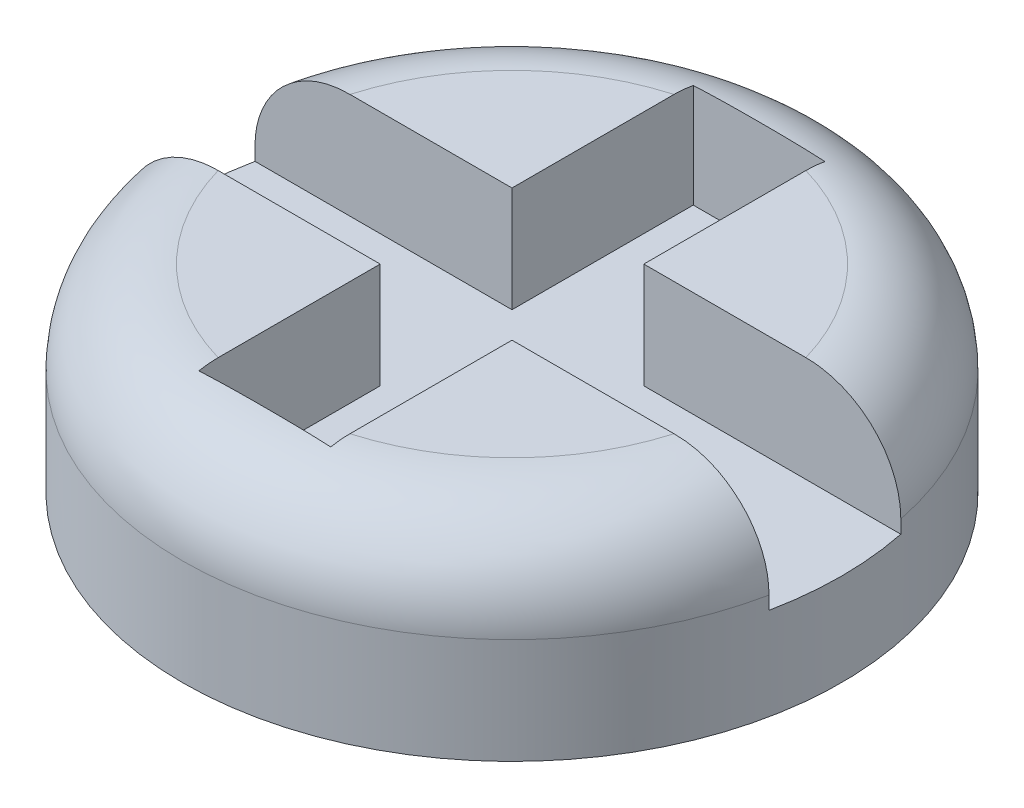
ISO-10303-21;
HEADER;
FILE_DESCRIPTION(('STEP AP214'),'2;1');
FILE_NAME('part.step','',(''),(''),'','','');
FILE_SCHEMA(('AUTOMOTIVE_DESIGN { 1 0 10303 214 1 1 1 1 }'));
ENDSEC;
DATA;
#1=APPLICATION_CONTEXT('core data for automotive mechanical design processes');
#2=APPLICATION_PROTOCOL_DEFINITION('international standard','automotive_design',2000,#1);
#3=PRODUCT_CONTEXT('',#1,'mechanical');
#4=PRODUCT('Part','Part','',(#3));
#5=PRODUCT_RELATED_PRODUCT_CATEGORY('part','',(#4));
#6=PRODUCT_DEFINITION_FORMATION('','',#4);
#7=PRODUCT_DEFINITION_CONTEXT('part definition',#1,'design');
#8=PRODUCT_DEFINITION('design','',#6,#7);
#9=PRODUCT_DEFINITION_SHAPE('','',#8);
#10=(LENGTH_UNIT() NAMED_UNIT(*) SI_UNIT(.MILLI.,.METRE.));
#11=(NAMED_UNIT(*) PLANE_ANGLE_UNIT() SI_UNIT($,.RADIAN.));
#12=(NAMED_UNIT(*) SI_UNIT($,.STERADIAN.) SOLID_ANGLE_UNIT());
#13=UNCERTAINTY_MEASURE_WITH_UNIT(LENGTH_MEASURE(1.E-05),#10,'distance_accuracy_value','');
#14=(GEOMETRIC_REPRESENTATION_CONTEXT(3) GLOBAL_UNCERTAINTY_ASSIGNED_CONTEXT((#13)) GLOBAL_UNIT_ASSIGNED_CONTEXT((#10,
#11,#12)) REPRESENTATION_CONTEXT('',''));
#15=CARTESIAN_POINT('',(0.,0.,0.));
#16=DIRECTION('',(0.,0.,1.));
#17=DIRECTION('',(1.,0.,0.));
#18=AXIS2_PLACEMENT_3D('',#15,#16,#17);
#19=CARTESIAN_POINT('',(-0.5,0.7,1.875));
#20=DIRECTION('',(-1.,0.,0.));
#21=DIRECTION('',(0.,0.,1.));
#22=AXIS2_PLACEMENT_3D('',#19,#20,#21);
#23=PLANE('',#22);
#24=CARTESIAN_POINT('',(-0.5,1.5,1.72916164657906));
#25=CARTESIAN_POINT('',(-0.5,1.5,1.80303155180772));
#26=CARTESIAN_POINT('',(-0.5,1.48575040161637,1.875));
#27=B_SPLINE_CURVE_WITH_KNOTS('',2,(#24,#25,#26),.UNSPECIFIED.,.F.,.F.,(3,3),(0.,1.),.UNSPECIFIED.);
#28=CARTESIAN_POINT('',(-0.5,1.5,1.72916164657906));
#29=VERTEX_POINT('',#28);
#30=CARTESIAN_POINT('',(-0.5,1.48575040161637,1.875));
#31=VERTEX_POINT('',#30);
#32=EDGE_CURVE('E531',#29,#31,#27,.T.);
#33=ORIENTED_EDGE('',*,*,#32,.T.);
#34=DIRECTION('',(0.,1.,0.));
#35=VECTOR('',#34,1.);
#36=CARTESIAN_POINT('',(-0.5,0.7,1.875));
#37=LINE('',#36,#35);
#38=CARTESIAN_POINT('',(-0.5,0.7,1.875));
#39=VERTEX_POINT('',#38);
#40=EDGE_CURVE('E11',#39,#31,#37,.T.);
#41=ORIENTED_EDGE('',*,*,#40,.F.);
#42=DIRECTION('',(0.,0.,1.));
#43=VECTOR('',#42,1.);
#44=CARTESIAN_POINT('',(-0.5,0.7,1.875));
#45=LINE('',#44,#43);
#46=CARTESIAN_POINT('',(-0.5,0.7,0.5));
#47=VERTEX_POINT('',#46);
#48=EDGE_CURVE('E223',#47,#39,#45,.T.);
#49=ORIENTED_EDGE('',*,*,#48,.F.);
#50=DIRECTION('',(0.,1.,0.));
#51=VECTOR('',#50,1.);
#52=CARTESIAN_POINT('',(-0.5,0.7,0.5));
#53=LINE('',#52,#51);
#54=CARTESIAN_POINT('',(-0.5,1.5,0.5));
#55=VERTEX_POINT('',#54);
#56=EDGE_CURVE('E178',#47,#55,#53,.T.);
#57=ORIENTED_EDGE('',*,*,#56,.T.);
#58=DIRECTION('',(0.,0.,1.));
#59=VECTOR('',#58,1.);
#60=CARTESIAN_POINT('',(-0.5,1.5,1.875));
#61=LINE('',#60,#59);
#62=EDGE_CURVE('E208',#55,#29,#61,.T.);
#63=ORIENTED_EDGE('',*,*,#62,.T.);
#64=EDGE_LOOP('',(#33,#41,#49,#57,#63));
#65=FACE_BOUND('',#64,.T.);
#66=ADVANCED_FACE('F16',(#65),#23,.F.);
#67=CARTESIAN_POINT('',(0.5,0.7,1.875));
#68=DIRECTION('',(0.,0.,1.));
#69=DIRECTION('',(1.,0.,0.));
#70=AXIS2_PLACEMENT_3D('',#67,#68,#69);
#71=PLANE('',#70);
#72=CARTESIAN_POINT('',(-0.50000000000035,1.48575040161635,1.875));
#73=CARTESIAN_POINT('',(-0.306527593114732,1.49596563404367,1.875));
#74=CARTESIAN_POINT('',(0.,1.49597054535375,1.875));
#75=CARTESIAN_POINT('',(0.306341613063809,1.49597545368399,1.875));
#76=CARTESIAN_POINT('',(0.500000000000349,1.48575040161635,1.875));
#77=B_SPLINE_CURVE_WITH_KNOTS('',2,(#72,#73,#74,#75,#76),.UNSPECIFIED.,.F.,.F.,(3,2,3),(0.,0.5,
1.),.UNSPECIFIED.);
#78=CARTESIAN_POINT('',(0.5,1.48575040161637,1.875));
#79=VERTEX_POINT('',#78);
#80=EDGE_CURVE('E529',#31,#79,#77,.T.);
#81=ORIENTED_EDGE('',*,*,#80,.T.);
#82=DIRECTION('',(0.,1.,0.));
#83=VECTOR('',#82,1.);
#84=CARTESIAN_POINT('',(0.5,0.7,1.875));
#85=LINE('',#84,#83);
#86=CARTESIAN_POINT('',(0.5,0.7,1.875));
#87=VERTEX_POINT('',#86);
#88=EDGE_CURVE('E28',#87,#79,#85,.T.);
#89=ORIENTED_EDGE('',*,*,#88,.F.);
#90=DIRECTION('',(1.,0.,0.));
#91=VECTOR('',#90,1.);
#92=CARTESIAN_POINT('',(0.5,0.7,1.875));
#93=LINE('',#92,#91);
#94=EDGE_CURVE('E187',#39,#87,#93,.T.);
#95=ORIENTED_EDGE('',*,*,#94,.F.);
#96=ORIENTED_EDGE('',*,*,#40,.T.);
#97=EDGE_LOOP('',(#81,#89,#95,#96));
#98=FACE_BOUND('',#97,.T.);
#99=ADVANCED_FACE('F371',(#98),#71,.F.);
#100=CARTESIAN_POINT('',(0.5,0.7,1.875));
#101=DIRECTION('',(1.,0.,0.));
#102=DIRECTION('',(0.,0.,-1.));
#103=AXIS2_PLACEMENT_3D('',#100,#101,#102);
#104=PLANE('',#103);
#105=CARTESIAN_POINT('',(0.5,1.48575040161637,1.875));
#106=CARTESIAN_POINT('',(0.5,1.5,1.80303155180772));
#107=CARTESIAN_POINT('',(0.5,1.5,1.72916164657906));
#108=B_SPLINE_CURVE_WITH_KNOTS('',2,(#105,#106,#107),.UNSPECIFIED.,.F.,.F.,(3,3),(0.,1.),.UNSPECIFIED.);
#109=CARTESIAN_POINT('',(0.5,1.5,1.72916164657906));
#110=VERTEX_POINT('',#109);
#111=EDGE_CURVE('E349',#79,#110,#108,.T.);
#112=ORIENTED_EDGE('',*,*,#111,.T.);
#113=DIRECTION('',(0.,0.,-1.));
#114=VECTOR('',#113,1.);
#115=CARTESIAN_POINT('',(0.5,1.5,1.875));
#116=LINE('',#115,#114);
#117=CARTESIAN_POINT('',(0.5,1.5,0.5));
#118=VERTEX_POINT('',#117);
#119=EDGE_CURVE('E173',#110,#118,#116,.T.);
#120=ORIENTED_EDGE('',*,*,#119,.T.);
#121=DIRECTION('',(0.,1.,0.));
#122=VECTOR('',#121,1.);
#123=CARTESIAN_POINT('',(0.5,0.7,0.5));
#124=LINE('',#123,#122);
#125=CARTESIAN_POINT('',(0.5,0.7,0.5));
#126=VERTEX_POINT('',#125);
#127=EDGE_CURVE('E167',#126,#118,#124,.T.);
#128=ORIENTED_EDGE('',*,*,#127,.F.);
#129=DIRECTION('',(0.,0.,-1.));
#130=VECTOR('',#129,1.);
#131=CARTESIAN_POINT('',(0.5,0.7,1.875));
#132=LINE('',#131,#130);
#133=EDGE_CURVE('E171',#87,#126,#132,.T.);
#134=ORIENTED_EDGE('',*,*,#133,.F.);
#135=ORIENTED_EDGE('',*,*,#88,.T.);
#136=EDGE_LOOP('',(#112,#120,#128,#134,#135));
#137=FACE_BOUND('',#136,.T.);
#138=ADVANCED_FACE('F170',(#137),#104,.F.);
#139=CARTESIAN_POINT('',(0.5,0.7,-0.5));
#140=DIRECTION('',(1.,0.,0.));
#141=DIRECTION('',(0.,1.,0.));
#142=AXIS2_PLACEMENT_3D('',#139,#140,#141);
#143=PLANE('',#142);
#144=CARTESIAN_POINT('',(0.5,1.5,-1.72916164657906));
#145=CARTESIAN_POINT('',(0.5,1.5,-1.80303155180772));
#146=CARTESIAN_POINT('',(0.5,1.48575040161637,-1.875));
#147=B_SPLINE_CURVE_WITH_KNOTS('',2,(#144,#145,#146),.UNSPECIFIED.,.F.,.F.,(3,3),(0.,1.),.UNSPECIFIED.);
#148=CARTESIAN_POINT('',(0.5,1.5,-1.72916164657906));
#149=VERTEX_POINT('',#148);
#150=CARTESIAN_POINT('',(0.5,1.48575040161637,-1.875));
#151=VERTEX_POINT('',#150);
#152=EDGE_CURVE('E562',#149,#151,#147,.T.);
#153=ORIENTED_EDGE('',*,*,#152,.T.);
#154=DIRECTION('',(0.,1.,0.));
#155=VECTOR('',#154,1.);
#156=CARTESIAN_POINT('',(0.5,0.7,-1.875));
#157=LINE('',#156,#155);
#158=CARTESIAN_POINT('',(0.5,0.7,-1.875));
#159=VERTEX_POINT('',#158);
#160=EDGE_CURVE('E385',#159,#151,#157,.T.);
#161=ORIENTED_EDGE('',*,*,#160,.F.);
#162=DIRECTION('',(0.,0.,-1.));
#163=VECTOR('',#162,1.);
#164=CARTESIAN_POINT('',(0.5,0.7,-0.5));
#165=LINE('',#164,#163);
#166=CARTESIAN_POINT('',(0.5,0.7,-0.5));
#167=VERTEX_POINT('',#166);
#168=EDGE_CURVE('E205',#167,#159,#165,.T.);
#169=ORIENTED_EDGE('',*,*,#168,.F.);
#170=DIRECTION('',(0.,1.,0.));
#171=VECTOR('',#170,1.);
#172=CARTESIAN_POINT('',(0.5,0.7,-0.5));
#173=LINE('',#172,#171);
#174=CARTESIAN_POINT('',(0.5,1.5,-0.5));
#175=VERTEX_POINT('',#174);
#176=EDGE_CURVE('E179',#167,#175,#173,.T.);
#177=ORIENTED_EDGE('',*,*,#176,.T.);
#178=DIRECTION('',(0.,0.,-1.));
#179=VECTOR('',#178,1.);
#180=CARTESIAN_POINT('',(0.5,1.5,-0.5));
#181=LINE('',#180,#179);
#182=EDGE_CURVE('E455',#175,#149,#181,.T.);
#183=ORIENTED_EDGE('',*,*,#182,.T.);
#184=EDGE_LOOP('',(#153,#161,#169,#177,#183));
#185=FACE_BOUND('',#184,.T.);
#186=ADVANCED_FACE('F370',(#185),#143,.F.);
#187=CARTESIAN_POINT('',(0.5,0.7,-1.875));
#188=DIRECTION('',(0.,0.,-1.));
#189=DIRECTION('',(0.,-1.,0.));
#190=AXIS2_PLACEMENT_3D('',#187,#188,#189);
#191=PLANE('',#190);
#192=CARTESIAN_POINT('',(0.5,1.48575040161637,-1.875));
#193=CARTESIAN_POINT('',(0.306527593114464,1.49596563404367,-1.875));
#194=CARTESIAN_POINT('',(0.,1.49597054535375,-1.875));
#195=CARTESIAN_POINT('',(-0.306341613063545,1.49597545368399,-1.875));
#196=CARTESIAN_POINT('',(-0.5,1.48575040161637,-1.875));
#197=B_SPLINE_CURVE_WITH_KNOTS('',2,(#192,#193,#194,#195,#196),.UNSPECIFIED.,.F.,.F.,(3,2,3),
(0.,0.5,1.),.UNSPECIFIED.);
#198=CARTESIAN_POINT('',(-0.5,1.48575040161637,-1.875));
#199=VERTEX_POINT('',#198);
#200=EDGE_CURVE('E407',#151,#199,#197,.T.);
#201=ORIENTED_EDGE('',*,*,#200,.T.);
#202=DIRECTION('',(0.,1.,0.));
#203=VECTOR('',#202,1.);
#204=CARTESIAN_POINT('',(-0.5,0.7,-1.875));
#205=LINE('',#204,#203);
#206=CARTESIAN_POINT('',(-0.5,0.7,-1.875));
#207=VERTEX_POINT('',#206);
#208=EDGE_CURVE('E231',#207,#199,#205,.T.);
#209=ORIENTED_EDGE('',*,*,#208,.F.);
#210=DIRECTION('',(-1.,0.,0.));
#211=VECTOR('',#210,1.);
#212=CARTESIAN_POINT('',(0.5,0.7,-1.875));
#213=LINE('',#212,#211);
#214=EDGE_CURVE('E221',#159,#207,#213,.T.);
#215=ORIENTED_EDGE('',*,*,#214,.F.);
#216=ORIENTED_EDGE('',*,*,#160,.T.);
#217=EDGE_LOOP('',(#201,#209,#215,#216));
#218=FACE_BOUND('',#217,.T.);
#219=ADVANCED_FACE('F18',(#218),#191,.F.);
#220=CARTESIAN_POINT('',(-0.5,0.7,-0.5));
#221=DIRECTION('',(-1.,0.,0.));
#222=DIRECTION('',(0.,1.,0.));
#223=AXIS2_PLACEMENT_3D('',#220,#221,#222);
#224=PLANE('',#223);
#225=CARTESIAN_POINT('',(-0.5,1.48575040161637,-1.875));
#226=CARTESIAN_POINT('',(-0.5,1.5,-1.80303155180772));
#227=CARTESIAN_POINT('',(-0.5,1.5,-1.72916164657906));
#228=B_SPLINE_CURVE_WITH_KNOTS('',2,(#225,#226,#227),.UNSPECIFIED.,.F.,.F.,(3,3),(0.,1.),.UNSPECIFIED.);
#229=CARTESIAN_POINT('',(-0.5,1.5,-1.72916164657906));
#230=VERTEX_POINT('',#229);
#231=EDGE_CURVE('E432',#199,#230,#228,.T.);
#232=ORIENTED_EDGE('',*,*,#231,.T.);
#233=DIRECTION('',(0.,0.,1.));
#234=VECTOR('',#233,1.);
#235=CARTESIAN_POINT('',(-0.5,1.5,-0.5));
#236=LINE('',#235,#234);
#237=CARTESIAN_POINT('',(-0.5,1.5,-0.5));
#238=VERTEX_POINT('',#237);
#239=EDGE_CURVE('E456',#230,#238,#236,.T.);
#240=ORIENTED_EDGE('',*,*,#239,.T.);
#241=DIRECTION('',(0.,1.,0.));
#242=VECTOR('',#241,1.);
#243=CARTESIAN_POINT('',(-0.5,0.7,-0.5));
#244=LINE('',#243,#242);
#245=CARTESIAN_POINT('',(-0.5,0.7,-0.5));
#246=VERTEX_POINT('',#245);
#247=EDGE_CURVE('E189',#246,#238,#244,.T.);
#248=ORIENTED_EDGE('',*,*,#247,.F.);
#249=DIRECTION('',(0.,0.,1.));
#250=VECTOR('',#249,1.);
#251=CARTESIAN_POINT('',(-0.5,0.7,-0.5));
#252=LINE('',#251,#250);
#253=EDGE_CURVE('E217',#207,#246,#252,.T.);
#254=ORIENTED_EDGE('',*,*,#253,.F.);
#255=ORIENTED_EDGE('',*,*,#208,.T.);
#256=EDGE_LOOP('',(#232,#240,#248,#254,#255));
#257=FACE_BOUND('',#256,.T.);
#258=ADVANCED_FACE('F281',(#257),#224,.F.);
#259=CARTESIAN_POINT('',(-2.5,0.7,0.5));
#260=DIRECTION('',(0.,0.,1.));
#261=DIRECTION('',(1.,0.,0.));
#262=AXIS2_PLACEMENT_3D('',#259,#260,#261);
#263=PLANE('',#262);
#264=CARTESIAN_POINT('',(-2.44948974278318,0.8,0.5));
#265=CARTESIAN_POINT('',(-2.44948974278318,0.9399420401889,0.5));
#266=CARTESIAN_POINT('',(-2.3936915840098,1.071123762178,0.5));
#267=CARTESIAN_POINT('',(-2.33928956920391,1.19902314342635,0.5));
#268=CARTESIAN_POINT('',(-2.23586640676673,1.2988065898787,0.5));
#269=CARTESIAN_POINT('',(-2.13584124675767,1.39531161798315,0.5));
#270=CARTESIAN_POINT('',(-2.00227134856293,1.44839534554384,0.5));
#271=CARTESIAN_POINT('',(-1.87242311146985,1.5,0.5));
#272=CARTESIAN_POINT('',(-1.72916164657906,1.5,0.5));
#273=B_SPLINE_CURVE_WITH_KNOTS('',2,(#264,#265,#266,#267,#268,#269,#270,#271,#272),
.UNSPECIFIED.,.F.,.F.,(3,2,2,2,3),(0.,0.25,0.5,0.75,1.),.UNSPECIFIED.);
#274=CARTESIAN_POINT('',(-2.44948974278318,0.8,0.5));
#275=VERTEX_POINT('',#274);
#276=CARTESIAN_POINT('',(-1.72916164657906,1.5,0.5));
#277=VERTEX_POINT('',#276);
#278=EDGE_CURVE('E500',#275,#277,#273,.T.);
#279=ORIENTED_EDGE('',*,*,#278,.T.);
#280=DIRECTION('',(1.,0.,0.));
#281=VECTOR('',#280,1.);
#282=CARTESIAN_POINT('',(-2.5,1.5,0.5));
#283=LINE('',#282,#281);
#284=EDGE_CURVE('E197',#277,#55,#283,.T.);
#285=ORIENTED_EDGE('',*,*,#284,.T.);
#286=ORIENTED_EDGE('',*,*,#56,.F.);
#287=DIRECTION('',(1.,0.,0.));
#288=VECTOR('',#287,1.);
#289=CARTESIAN_POINT('',(-2.5,0.7,0.5));
#290=LINE('',#289,#288);
#291=CARTESIAN_POINT('',(-2.44948974278318,0.7,0.5));
#292=VERTEX_POINT('',#291);
#293=EDGE_CURVE('E226',#292,#47,#290,.T.);
#294=ORIENTED_EDGE('',*,*,#293,.F.);
#295=DIRECTION('',(0.,-1.,0.));
#296=VECTOR('',#295,1.);
#297=CARTESIAN_POINT('',(-2.44948974278318,1.5,0.5));
#298=LINE('',#297,#296);
#299=EDGE_CURVE('E216',#275,#292,#298,.T.);
#300=ORIENTED_EDGE('',*,*,#299,.F.);
#301=EDGE_LOOP('',(#279,#285,#286,#294,#300));
#302=FACE_BOUND('',#301,.T.);
#303=ADVANCED_FACE('F367',(#302),#263,.F.);
#304=CARTESIAN_POINT('',(0.5,0.7,0.5));
#305=DIRECTION('',(0.,0.,1.));
#306=DIRECTION('',(1.,0.,0.));
#307=AXIS2_PLACEMENT_3D('',#304,#305,#306);
#308=PLANE('',#307);
#309=DIRECTION('',(1.,0.,0.));
#310=VECTOR('',#309,1.);
#311=CARTESIAN_POINT('',(0.5,0.7,0.5));
#312=LINE('',#311,#310);
#313=CARTESIAN_POINT('',(2.44948974278318,0.7,0.5));
#314=VERTEX_POINT('',#313);
#315=EDGE_CURVE('E184',#126,#314,#312,.T.);
#316=ORIENTED_EDGE('',*,*,#315,.F.);
#317=ORIENTED_EDGE('',*,*,#127,.T.);
#318=DIRECTION('',(1.,0.,0.));
#319=VECTOR('',#318,1.);
#320=CARTESIAN_POINT('',(0.5,1.5,0.5));
#321=LINE('',#320,#319);
#322=CARTESIAN_POINT('',(1.72916164657906,1.5,0.5));
#323=VERTEX_POINT('',#322);
#324=EDGE_CURVE('E342',#118,#323,#321,.T.);
#325=ORIENTED_EDGE('',*,*,#324,.T.);
#326=CARTESIAN_POINT('',(1.72916164657906,1.5,0.5));
#327=CARTESIAN_POINT('',(2.02296641202289,1.5,0.5));
#328=CARTESIAN_POINT('',(2.23586640676673,1.2988065898787,0.5));
#329=CARTESIAN_POINT('',(2.33498515788924,1.20513801290529,0.5));
#330=CARTESIAN_POINT('',(2.39369158400979,1.071123762178,0.5));
#331=CARTESIAN_POINT('',(2.44948974278318,0.943748465568721,0.5));
#332=CARTESIAN_POINT('',(2.44948974278318,0.8,0.5));
#333=B_SPLINE_CURVE_WITH_KNOTS('',2,(#326,#327,#328,#329,#330,#331,#332),.UNSPECIFIED.,.F.,.F.,
(3,2,2,3),(0.,0.5,0.75,1.),.UNSPECIFIED.);
#334=CARTESIAN_POINT('',(2.44948974278318,0.8,0.5));
#335=VERTEX_POINT('',#334);
#336=EDGE_CURVE('E350',#323,#335,#333,.T.);
#337=ORIENTED_EDGE('',*,*,#336,.T.);
#338=DIRECTION('',(0.,1.,0.));
#339=VECTOR('',#338,1.);
#340=CARTESIAN_POINT('',(2.44948974278318,1.5,0.5));
#341=LINE('',#340,#339);
#342=EDGE_CURVE('E193',#314,#335,#341,.T.);
#343=ORIENTED_EDGE('',*,*,#342,.F.);
#344=EDGE_LOOP('',(#316,#317,#325,#337,#343));
#345=FACE_BOUND('',#344,.T.);
#346=ADVANCED_FACE('F191',(#345),#308,.F.);
#347=CARTESIAN_POINT('',(0.5,0.7,-0.5));
#348=DIRECTION('',(0.,0.,-1.));
#349=DIRECTION('',(0.,-1.,0.));
#350=AXIS2_PLACEMENT_3D('',#347,#348,#349);
#351=PLANE('',#350);
#352=CARTESIAN_POINT('',(2.44948974278318,0.8,-0.5));
#353=CARTESIAN_POINT('',(2.44948974278318,0.9399420401889,-0.5));
#354=CARTESIAN_POINT('',(2.39369158400979,1.071123762178,-0.5));
#355=CARTESIAN_POINT('',(2.33928956920391,1.19902314342635,-0.5));
#356=CARTESIAN_POINT('',(2.23586640676673,1.2988065898787,-0.5));
#357=CARTESIAN_POINT('',(2.13584124675767,1.39531161798315,-0.5));
#358=CARTESIAN_POINT('',(2.00227134856293,1.44839534554384,-0.5));
#359=CARTESIAN_POINT('',(1.87242311146985,1.5,-0.5));
#360=CARTESIAN_POINT('',(1.72916164657906,1.5,-0.5));
#361=B_SPLINE_CURVE_WITH_KNOTS('',2,(#352,#353,#354,#355,#356,#357,#358,#359,#360),
.UNSPECIFIED.,.F.,.F.,(3,2,2,2,3),(0.,0.25,0.5,0.75,1.),.UNSPECIFIED.);
#362=CARTESIAN_POINT('',(2.44948974278318,0.8,-0.5));
#363=VERTEX_POINT('',#362);
#364=CARTESIAN_POINT('',(1.72916164657906,1.5,-0.5));
#365=VERTEX_POINT('',#364);
#366=EDGE_CURVE('E263',#363,#365,#361,.T.);
#367=ORIENTED_EDGE('',*,*,#366,.T.);
#368=DIRECTION('',(-1.,0.,0.));
#369=VECTOR('',#368,1.);
#370=CARTESIAN_POINT('',(0.5,1.5,-0.5));
#371=LINE('',#370,#369);
#372=EDGE_CURVE('E637',#365,#175,#371,.T.);
#373=ORIENTED_EDGE('',*,*,#372,.T.);
#374=ORIENTED_EDGE('',*,*,#176,.F.);
#375=DIRECTION('',(-1.,0.,0.));
#376=VECTOR('',#375,1.);
#377=CARTESIAN_POINT('',(0.5,0.7,-0.5));
#378=LINE('',#377,#376);
#379=CARTESIAN_POINT('',(2.44948974278318,0.7,-0.5));
#380=VERTEX_POINT('',#379);
#381=EDGE_CURVE('E196',#380,#167,#378,.T.);
#382=ORIENTED_EDGE('',*,*,#381,.F.);
#383=DIRECTION('',(0.,-1.,0.));
#384=VECTOR('',#383,1.);
#385=CARTESIAN_POINT('',(2.44948974278318,1.5,-0.5));
#386=LINE('',#385,#384);
#387=EDGE_CURVE('E258',#363,#380,#386,.T.);
#388=ORIENTED_EDGE('',*,*,#387,.F.);
#389=EDGE_LOOP('',(#367,#373,#374,#382,#388));
#390=FACE_BOUND('',#389,.T.);
#391=ADVANCED_FACE('F270',(#390),#351,.F.);
#392=CARTESIAN_POINT('',(-2.5,0.7,-0.5));
#393=DIRECTION('',(0.,0.,-1.));
#394=DIRECTION('',(0.,-1.,0.));
#395=AXIS2_PLACEMENT_3D('',#392,#393,#394);
#396=PLANE('',#395);
#397=DIRECTION('',(-1.,0.,0.));
#398=VECTOR('',#397,1.);
#399=CARTESIAN_POINT('',(-2.5,0.7,-0.5));
#400=LINE('',#399,#398);
#401=CARTESIAN_POINT('',(-2.44948974278318,0.7,-0.5));
#402=VERTEX_POINT('',#401);
#403=EDGE_CURVE('E220',#246,#402,#400,.T.);
#404=ORIENTED_EDGE('',*,*,#403,.F.);
#405=ORIENTED_EDGE('',*,*,#247,.T.);
#406=DIRECTION('',(-1.,0.,0.));
#407=VECTOR('',#406,1.);
#408=CARTESIAN_POINT('',(-2.5,1.5,-0.5));
#409=LINE('',#408,#407);
#410=CARTESIAN_POINT('',(-1.72916164657906,1.5,-0.5));
#411=VERTEX_POINT('',#410);
#412=EDGE_CURVE('E461',#238,#411,#409,.T.);
#413=ORIENTED_EDGE('',*,*,#412,.T.);
#414=CARTESIAN_POINT('',(-1.72916164657906,1.5,-0.5));
#415=CARTESIAN_POINT('',(-2.02296641202289,1.5,-0.5));
#416=CARTESIAN_POINT('',(-2.23586640676673,1.2988065898787,-0.5));
#417=CARTESIAN_POINT('',(-2.33498515788924,1.20513801290529,-0.5));
#418=CARTESIAN_POINT('',(-2.3936915840098,1.071123762178,-0.5));
#419=CARTESIAN_POINT('',(-2.44948974278318,0.943748465568721,-0.5));
#420=CARTESIAN_POINT('',(-2.44948974278318,0.8,-0.5));
#421=B_SPLINE_CURVE_WITH_KNOTS('',2,(#414,#415,#416,#417,#418,#419,#420),.UNSPECIFIED.,.F.,.F.,
(3,2,2,3),(0.,0.5,0.75,1.),.UNSPECIFIED.);
#422=CARTESIAN_POINT('',(-2.44948974278318,0.8,-0.5));
#423=VERTEX_POINT('',#422);
#424=EDGE_CURVE('E341',#411,#423,#421,.T.);
#425=ORIENTED_EDGE('',*,*,#424,.T.);
#426=DIRECTION('',(0.,1.,0.));
#427=VECTOR('',#426,1.);
#428=CARTESIAN_POINT('',(-2.44948974278318,1.5,-0.5));
#429=LINE('',#428,#427);
#430=EDGE_CURVE('E215',#402,#423,#429,.T.);
#431=ORIENTED_EDGE('',*,*,#430,.F.);
#432=EDGE_LOOP('',(#404,#405,#413,#425,#431));
#433=FACE_BOUND('',#432,.T.);
#434=ADVANCED_FACE('F280',(#433),#396,.F.);
#435=CARTESIAN_POINT('',(0.,0.7,0.));
#436=DIRECTION('',(0.,1.,0.));
#437=DIRECTION('',(1.,0.,0.));
#438=AXIS2_PLACEMENT_3D('',#435,#436,#437);
#439=PLANE('',#438);
#440=ORIENTED_EDGE('',*,*,#315,.T.);
#441=CARTESIAN_POINT('',(0.,0.7,0.));
#442=DIRECTION('',(0.,1.,0.));
#443=DIRECTION('',(0.,0.,1.));
#444=AXIS2_PLACEMENT_3D('',#441,#442,#443);
#445=CIRCLE('',#444,2.5);
#446=EDGE_CURVE('E255',#314,#380,#445,.T.);
#447=ORIENTED_EDGE('',*,*,#446,.T.);
#448=ORIENTED_EDGE('',*,*,#381,.T.);
#449=ORIENTED_EDGE('',*,*,#168,.T.);
#450=ORIENTED_EDGE('',*,*,#214,.T.);
#451=ORIENTED_EDGE('',*,*,#253,.T.);
#452=ORIENTED_EDGE('',*,*,#403,.T.);
#453=CARTESIAN_POINT('',(0.,0.7,0.));
#454=DIRECTION('',(0.,1.,0.));
#455=DIRECTION('',(0.,0.,1.));
#456=AXIS2_PLACEMENT_3D('',#453,#454,#455);
#457=CIRCLE('',#456,2.5);
#458=EDGE_CURVE('E211',#402,#292,#457,.T.);
#459=ORIENTED_EDGE('',*,*,#458,.T.);
#460=ORIENTED_EDGE('',*,*,#293,.T.);
#461=ORIENTED_EDGE('',*,*,#48,.T.);
#462=ORIENTED_EDGE('',*,*,#94,.T.);
#463=ORIENTED_EDGE('',*,*,#133,.T.);
#464=EDGE_LOOP('',(#440,#447,#448,#449,#450,#451,#452,#459,#460,#461,#462,#463));
#465=FACE_BOUND('',#464,.T.);
#466=ADVANCED_FACE('F182',(#465),#439,.T.);
#467=CARTESIAN_POINT('',(0.,0.,0.));
#468=DIRECTION('',(0.,1.,0.));
#469=DIRECTION('',(1.,0.,0.));
#470=AXIS2_PLACEMENT_3D('',#467,#468,#469);
#471=PLANE('',#470);
#472=CARTESIAN_POINT('',(0.,0.,0.));
#473=DIRECTION('',(0.,1.,0.));
#474=DIRECTION('',(0.,0.,1.));
#475=AXIS2_PLACEMENT_3D('',#472,#473,#474);
#476=CIRCLE('',#475,2.5);
#477=CARTESIAN_POINT('',(0.,0.,2.5));
#478=VERTEX_POINT('',#477);
#479=EDGE_CURVE('E232',#478,#478,#476,.T.);
#480=ORIENTED_EDGE('',*,*,#479,.F.);
#481=EDGE_LOOP('',(#480));
#482=FACE_BOUND('',#481,.T.);
#483=ADVANCED_FACE('F294',(#482),#471,.F.);
#484=CARTESIAN_POINT('',(0.,1.5,0.));
#485=DIRECTION('',(0.,1.,0.));
#486=DIRECTION('',(1.,0.,0.));
#487=AXIS2_PLACEMENT_3D('',#484,#485,#486);
#488=PLANE('',#487);
#489=ORIENTED_EDGE('',*,*,#62,.F.);
#490=ORIENTED_EDGE('',*,*,#284,.F.);
#491=CARTESIAN_POINT('',(0.,1.5,0.));
#492=DIRECTION('',(0.,1.,0.));
#493=DIRECTION('',(0.,0.,1.));
#494=AXIS2_PLACEMENT_3D('',#491,#492,#493);
#495=CIRCLE('',#494,1.8);
#496=EDGE_CURVE('E537',#277,#29,#495,.T.);
#497=ORIENTED_EDGE('',*,*,#496,.T.);
#498=EDGE_LOOP('',(#489,#490,#497));
#499=FACE_BOUND('',#498,.T.);
#500=ADVANCED_FACE('F297',(#499),#488,.T.);
#501=CARTESIAN_POINT('',(0.,0.8,0.));
#502=DIRECTION('',(0.,1.,0.));
#503=DIRECTION('',(0.,0.,-1.));
#504=AXIS2_PLACEMENT_3D('',#501,#502,#503);
#505=TOROIDAL_SURFACE('',#504,1.8,0.7);
#506=ORIENTED_EDGE('',*,*,#424,.F.);
#507=CARTESIAN_POINT('',(0.,1.5,0.));
#508=DIRECTION('',(0.,1.,0.));
#509=DIRECTION('',(0.,0.,1.));
#510=AXIS2_PLACEMENT_3D('',#507,#508,#509);
#511=CIRCLE('',#510,1.8);
#512=EDGE_CURVE('E446',#230,#411,#511,.T.);
#513=ORIENTED_EDGE('',*,*,#512,.F.);
#514=ORIENTED_EDGE('',*,*,#231,.F.);
#515=ORIENTED_EDGE('',*,*,#200,.F.);
#516=ORIENTED_EDGE('',*,*,#152,.F.);
#517=CARTESIAN_POINT('',(0.,1.5,0.));
#518=DIRECTION('',(0.,1.,0.));
#519=DIRECTION('',(0.,0.,1.));
#520=AXIS2_PLACEMENT_3D('',#517,#518,#519);
#521=CIRCLE('',#520,1.8);
#522=EDGE_CURVE('E641',#365,#149,#521,.T.);
#523=ORIENTED_EDGE('',*,*,#522,.F.);
#524=ORIENTED_EDGE('',*,*,#366,.F.);
#525=CARTESIAN_POINT('',(0.,0.8,0.));
#526=DIRECTION('',(0.,-1.,0.));
#527=DIRECTION('',(0.,0.,1.));
#528=AXIS2_PLACEMENT_3D('',#525,#526,#527);
#529=CIRCLE('',#528,2.5);
#530=EDGE_CURVE('E493',#423,#363,#529,.T.);
#531=ORIENTED_EDGE('',*,*,#530,.F.);
#532=EDGE_LOOP('',(#506,#513,#514,#515,#516,#523,#524,#531));
#533=FACE_BOUND('',#532,.T.);
#534=ADVANCED_FACE('F288',(#533),#505,.T.);
#535=CARTESIAN_POINT('',(0.,1.5,0.));
#536=DIRECTION('',(0.,1.,0.));
#537=DIRECTION('',(1.,0.,0.));
#538=AXIS2_PLACEMENT_3D('',#535,#536,#537);
#539=PLANE('',#538);
#540=ORIENTED_EDGE('',*,*,#324,.F.);
#541=ORIENTED_EDGE('',*,*,#119,.F.);
#542=CARTESIAN_POINT('',(0.,1.5,0.));
#543=DIRECTION('',(0.,1.,0.));
#544=DIRECTION('',(0.,0.,1.));
#545=AXIS2_PLACEMENT_3D('',#542,#543,#544);
#546=CIRCLE('',#545,1.8);
#547=EDGE_CURVE('E345',#110,#323,#546,.T.);
#548=ORIENTED_EDGE('',*,*,#547,.T.);
#549=EDGE_LOOP('',(#540,#541,#548));
#550=FACE_BOUND('',#549,.T.);
#551=ADVANCED_FACE('F284',(#550),#539,.T.);
#552=CARTESIAN_POINT('',(0.,1.5,0.));
#553=DIRECTION('',(0.,1.,0.));
#554=DIRECTION('',(1.,0.,0.));
#555=AXIS2_PLACEMENT_3D('',#552,#553,#554);
#556=PLANE('',#555);
#557=ORIENTED_EDGE('',*,*,#182,.F.);
#558=ORIENTED_EDGE('',*,*,#372,.F.);
#559=ORIENTED_EDGE('',*,*,#522,.T.);
#560=EDGE_LOOP('',(#557,#558,#559));
#561=FACE_BOUND('',#560,.T.);
#562=ADVANCED_FACE('F287',(#561),#556,.T.);
#563=CARTESIAN_POINT('',(0.,1.5,0.));
#564=DIRECTION('',(0.,1.,0.));
#565=DIRECTION('',(1.,0.,0.));
#566=AXIS2_PLACEMENT_3D('',#563,#564,#565);
#567=PLANE('',#566);
#568=ORIENTED_EDGE('',*,*,#412,.F.);
#569=ORIENTED_EDGE('',*,*,#239,.F.);
#570=ORIENTED_EDGE('',*,*,#512,.T.);
#571=EDGE_LOOP('',(#568,#569,#570));
#572=FACE_BOUND('',#571,.T.);
#573=ADVANCED_FACE('F292',(#572),#567,.T.);
#574=CARTESIAN_POINT('',(0.,1.5,0.));
#575=DIRECTION('',(0.,-1.,0.));
#576=DIRECTION('',(0.,0.,-1.));
#577=AXIS2_PLACEMENT_3D('',#574,#575,#576);
#578=CYLINDRICAL_SURFACE('',#577,2.5);
#579=ORIENTED_EDGE('',*,*,#479,.T.);
#580=DIRECTION('',(0.,1.,0.));
#581=VECTOR('',#580,1.);
#582=CARTESIAN_POINT('',(0.,1.5,2.5));
#583=LINE('',#582,#581);
#584=CARTESIAN_POINT('',(0.,0.8,2.5));
#585=VERTEX_POINT('',#584);
#586=EDGE_CURVE('E236',#478,#585,#583,.T.);
#587=ORIENTED_EDGE('',*,*,#586,.T.);
#588=CARTESIAN_POINT('',(0.,0.8,0.));
#589=DIRECTION('',(0.,-1.,0.));
#590=DIRECTION('',(0.,0.,1.));
#591=AXIS2_PLACEMENT_3D('',#588,#589,#590);
#592=CIRCLE('',#591,2.5);
#593=EDGE_CURVE('E237',#585,#275,#592,.T.);
#594=ORIENTED_EDGE('',*,*,#593,.T.);
#595=ORIENTED_EDGE('',*,*,#299,.T.);
#596=ORIENTED_EDGE('',*,*,#458,.F.);
#597=ORIENTED_EDGE('',*,*,#430,.T.);
#598=ORIENTED_EDGE('',*,*,#530,.T.);
#599=ORIENTED_EDGE('',*,*,#387,.T.);
#600=ORIENTED_EDGE('',*,*,#446,.F.);
#601=ORIENTED_EDGE('',*,*,#342,.T.);
#602=CARTESIAN_POINT('',(0.,0.8,0.));
#603=DIRECTION('',(0.,-1.,0.));
#604=DIRECTION('',(0.,0.,1.));
#605=AXIS2_PLACEMENT_3D('',#602,#603,#604);
#606=CIRCLE('',#605,2.5);
#607=EDGE_CURVE('E551',#335,#585,#606,.T.);
#608=ORIENTED_EDGE('',*,*,#607,.T.);
#609=ORIENTED_EDGE('',*,*,#586,.F.);
#610=EDGE_LOOP('',(#579,#587,#594,#595,#596,#597,#598,#599,#600,#601,#608,#609));
#611=FACE_BOUND('',#610,.T.);
#612=ADVANCED_FACE('F303',(#611),#578,.T.);
#613=CARTESIAN_POINT('',(0.,0.8,0.));
#614=DIRECTION('',(0.,1.,0.));
#615=DIRECTION('',(0.,0.,1.));
#616=AXIS2_PLACEMENT_3D('',#613,#614,#615);
#617=TOROIDAL_SURFACE('',#616,1.8,0.7);
#618=ORIENTED_EDGE('',*,*,#607,.F.);
#619=ORIENTED_EDGE('',*,*,#336,.F.);
#620=ORIENTED_EDGE('',*,*,#547,.F.);
#621=ORIENTED_EDGE('',*,*,#111,.F.);
#622=ORIENTED_EDGE('',*,*,#80,.F.);
#623=ORIENTED_EDGE('',*,*,#32,.F.);
#624=ORIENTED_EDGE('',*,*,#496,.F.);
#625=ORIENTED_EDGE('',*,*,#278,.F.);
#626=ORIENTED_EDGE('',*,*,#593,.F.);
#627=EDGE_LOOP('',(#618,#619,#620,#621,#622,#623,#624,#625,#626));
#628=FACE_BOUND('',#627,.T.);
#629=ADVANCED_FACE('F299',(#628),#617,.T.);
#630=CLOSED_SHELL('',(#66,#99,#138,#186,#219,#258,#303,#346,#391,#434,#466,#483,#500,#534,#551,
#562,#573,#612,#629));
#631=MANIFOLD_SOLID_BREP('B1',#630);
#632=ADVANCED_BREP_SHAPE_REPRESENTATION('',(#18,#631),#14);
#633=SHAPE_DEFINITION_REPRESENTATION(#9,#632);
ENDSEC;
END-ISO-10303-21;
